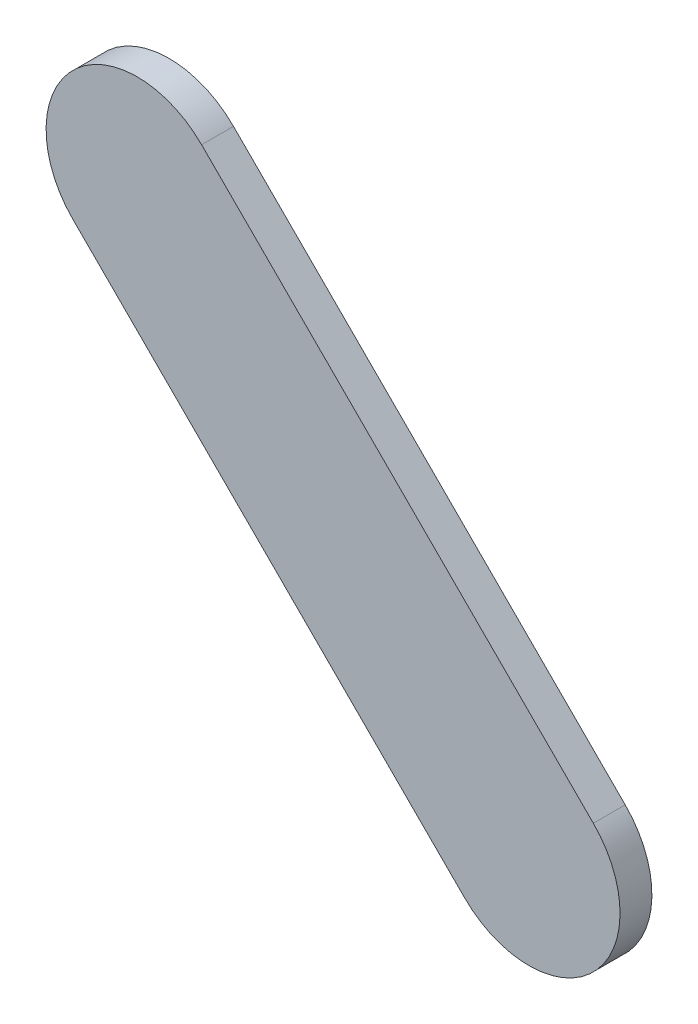
ISO-10303-21;
HEADER;
FILE_DESCRIPTION(('STEP AP214'),'2;1');
FILE_NAME('part.step','',(''),(''),'','','');
FILE_SCHEMA(('AUTOMOTIVE_DESIGN { 1 0 10303 214 1 1 1 1 }'));
ENDSEC;
DATA;
#1=APPLICATION_CONTEXT('core data for automotive mechanical design processes');
#2=APPLICATION_PROTOCOL_DEFINITION('international standard','automotive_design',2000,#1);
#3=PRODUCT_CONTEXT('',#1,'mechanical');
#4=PRODUCT('Part','Part','',(#3));
#5=PRODUCT_RELATED_PRODUCT_CATEGORY('part','',(#4));
#6=PRODUCT_DEFINITION_FORMATION('','',#4);
#7=PRODUCT_DEFINITION_CONTEXT('part definition',#1,'design');
#8=PRODUCT_DEFINITION('design','',#6,#7);
#9=PRODUCT_DEFINITION_SHAPE('','',#8);
#10=(LENGTH_UNIT() NAMED_UNIT(*) SI_UNIT(.MILLI.,.METRE.));
#11=(NAMED_UNIT(*) PLANE_ANGLE_UNIT() SI_UNIT($,.RADIAN.));
#12=(NAMED_UNIT(*) SI_UNIT($,.STERADIAN.) SOLID_ANGLE_UNIT());
#13=UNCERTAINTY_MEASURE_WITH_UNIT(LENGTH_MEASURE(1.E-05),#10,'distance_accuracy_value','');
#14=(GEOMETRIC_REPRESENTATION_CONTEXT(3) GLOBAL_UNCERTAINTY_ASSIGNED_CONTEXT((#13)) GLOBAL_UNIT_ASSIGNED_CONTEXT((#10,
#11,#12)) REPRESENTATION_CONTEXT('',''));
#15=CARTESIAN_POINT('',(0.,0.,0.));
#16=DIRECTION('',(0.,0.,1.));
#17=DIRECTION('',(1.,0.,0.));
#18=AXIS2_PLACEMENT_3D('',#15,#16,#17);
#19=CARTESIAN_POINT('',(81.799289,-136.47071,1.635));
#20=DIRECTION('',(0.,0.,1.));
#21=DIRECTION('',(1.,0.,0.));
#22=AXIS2_PLACEMENT_3D('',#19,#20,#21);
#23=PLANE('',#22);
#24=DIRECTION('',(0.707106781186548,-0.707106781186548,0.));
#25=VECTOR('',#24,1.);
#26=CARTESIAN_POINT('',(81.799289,-136.47071,1.635));
#27=LINE('',#26,#25);
#28=CARTESIAN_POINT('',(81.799289,-136.47071,1.635));
#29=VERTEX_POINT('',#28);
#30=CARTESIAN_POINT('',(82.229289,-136.90071,1.635));
#31=VERTEX_POINT('',#30);
#32=EDGE_CURVE('E69',#29,#31,#27,.T.);
#33=ORIENTED_EDGE('',*,*,#32,.T.);
#34=CARTESIAN_POINT('',(82.2999995,-136.8299995,1.635));
#35=DIRECTION('',(0.,0.,1.));
#36=DIRECTION('',(-0.707106781186048,-0.707106781187047,0.));
#37=AXIS2_PLACEMENT_3D('',#34,#35,#36);
#38=CIRCLE('',#37,0.09999974810219);
#39=CARTESIAN_POINT('',(82.37071,-136.759289,1.635));
#40=VERTEX_POINT('',#39);
#41=EDGE_CURVE('E66',#31,#40,#38,.T.);
#42=ORIENTED_EDGE('',*,*,#41,.T.);
#43=DIRECTION('',(-0.707106781186548,0.707106781186548,0.));
#44=VECTOR('',#43,1.);
#45=CARTESIAN_POINT('',(82.37071,-136.759289,1.635));
#46=LINE('',#45,#44);
#47=CARTESIAN_POINT('',(81.94071,-136.329289,1.635));
#48=VERTEX_POINT('',#47);
#49=EDGE_CURVE('E53',#40,#48,#46,.T.);
#50=ORIENTED_EDGE('',*,*,#49,.T.);
#51=CARTESIAN_POINT('',(81.8699995,-136.3999995,1.635));
#52=DIRECTION('',(0.,0.,1.));
#53=DIRECTION('',(0.707106781186548,0.707106781186548,0.));
#54=AXIS2_PLACEMENT_3D('',#51,#52,#53);
#55=CIRCLE('',#54,0.09999974810218);
#56=EDGE_CURVE('E11',#48,#29,#55,.T.);
#57=ORIENTED_EDGE('',*,*,#56,.T.);
#58=EDGE_LOOP('',(#33,#42,#50,#57));
#59=FACE_BOUND('',#58,.T.);
#60=ADVANCED_FACE('F17',(#59),#23,.T.);
#61=CARTESIAN_POINT('',(81.799289,-136.47071,1.6));
#62=DIRECTION('',(0.,0.,1.));
#63=DIRECTION('',(1.,0.,0.));
#64=AXIS2_PLACEMENT_3D('',#61,#62,#63);
#65=PLANE('',#64);
#66=CARTESIAN_POINT('',(81.8699995,-136.3999995,1.6));
#67=DIRECTION('',(0.,0.,1.));
#68=DIRECTION('',(0.707106781186548,0.707106781186548,0.));
#69=AXIS2_PLACEMENT_3D('',#66,#67,#68);
#70=CIRCLE('',#69,0.09999974810218);
#71=CARTESIAN_POINT('',(81.94071,-136.329289,1.6));
#72=VERTEX_POINT('',#71);
#73=CARTESIAN_POINT('',(81.799289,-136.47071,1.6));
#74=VERTEX_POINT('',#73);
#75=EDGE_CURVE('E26',#72,#74,#70,.T.);
#76=ORIENTED_EDGE('',*,*,#75,.F.);
#77=DIRECTION('',(-0.707106781186548,0.707106781186548,0.));
#78=VECTOR('',#77,1.);
#79=CARTESIAN_POINT('',(82.37071,-136.759289,1.6));
#80=LINE('',#79,#78);
#81=CARTESIAN_POINT('',(82.37071,-136.759289,1.6));
#82=VERTEX_POINT('',#81);
#83=EDGE_CURVE('E74',#82,#72,#80,.T.);
#84=ORIENTED_EDGE('',*,*,#83,.F.);
#85=CARTESIAN_POINT('',(82.2999995,-136.8299995,1.6));
#86=DIRECTION('',(0.,0.,1.));
#87=DIRECTION('',(-0.707106781186048,-0.707106781187047,0.));
#88=AXIS2_PLACEMENT_3D('',#85,#86,#87);
#89=CIRCLE('',#88,0.09999974810219);
#90=CARTESIAN_POINT('',(82.229289,-136.90071,1.6));
#91=VERTEX_POINT('',#90);
#92=EDGE_CURVE('E78',#91,#82,#89,.T.);
#93=ORIENTED_EDGE('',*,*,#92,.F.);
#94=DIRECTION('',(0.707106781186548,-0.707106781186548,0.));
#95=VECTOR('',#94,1.);
#96=CARTESIAN_POINT('',(81.799289,-136.47071,1.6));
#97=LINE('',#96,#95);
#98=EDGE_CURVE('E100',#74,#91,#97,.T.);
#99=ORIENTED_EDGE('',*,*,#98,.F.);
#100=EDGE_LOOP('',(#76,#84,#93,#99));
#101=FACE_BOUND('',#100,.T.);
#102=ADVANCED_FACE('F94',(#101),#65,.F.);
#103=CARTESIAN_POINT('',(81.8699995,-136.3999995,1.6));
#104=DIRECTION('',(0.,0.,-1.));
#105=DIRECTION('',(0.707106781186548,0.707106781186548,0.));
#106=AXIS2_PLACEMENT_3D('',#103,#104,#105);
#107=CYLINDRICAL_SURFACE('',#106,0.09999974810218);
#108=ORIENTED_EDGE('',*,*,#75,.T.);
#109=DIRECTION('',(0.,0.,1.));
#110=VECTOR('',#109,1.);
#111=CARTESIAN_POINT('',(81.799289,-136.47071,1.6));
#112=LINE('',#111,#110);
#113=EDGE_CURVE('E85',#74,#29,#112,.T.);
#114=ORIENTED_EDGE('',*,*,#113,.T.);
#115=ORIENTED_EDGE('',*,*,#56,.F.);
#116=DIRECTION('',(0.,0.,1.));
#117=VECTOR('',#116,1.);
#118=CARTESIAN_POINT('',(81.94071,-136.329289,1.6));
#119=LINE('',#118,#117);
#120=EDGE_CURVE('E60',#72,#48,#119,.T.);
#121=ORIENTED_EDGE('',*,*,#120,.F.);
#122=EDGE_LOOP('',(#108,#114,#115,#121));
#123=FACE_BOUND('',#122,.T.);
#124=ADVANCED_FACE('F104',(#123),#107,.T.);
#125=CARTESIAN_POINT('',(82.37071,-136.759289,1.6));
#126=DIRECTION('',(-0.707106781186548,-0.707106781186548,0.));
#127=DIRECTION('',(-0.707106781186548,0.707106781186548,0.));
#128=AXIS2_PLACEMENT_3D('',#125,#126,#127);
#129=PLANE('',#128);
#130=ORIENTED_EDGE('',*,*,#83,.T.);
#131=ORIENTED_EDGE('',*,*,#120,.T.);
#132=ORIENTED_EDGE('',*,*,#49,.F.);
#133=DIRECTION('',(0.,0.,1.));
#134=VECTOR('',#133,1.);
#135=CARTESIAN_POINT('',(82.37071,-136.759289,1.6));
#136=LINE('',#135,#134);
#137=EDGE_CURVE('E58',#82,#40,#136,.T.);
#138=ORIENTED_EDGE('',*,*,#137,.F.);
#139=EDGE_LOOP('',(#130,#131,#132,#138));
#140=FACE_BOUND('',#139,.T.);
#141=ADVANCED_FACE('F56',(#140),#129,.F.);
#142=CARTESIAN_POINT('',(82.2999995,-136.8299995,1.6));
#143=DIRECTION('',(0.,0.,-1.));
#144=DIRECTION('',(-0.707106781186048,-0.707106781187048,0.));
#145=AXIS2_PLACEMENT_3D('',#142,#143,#144);
#146=CYLINDRICAL_SURFACE('',#145,0.09999974810219);
#147=ORIENTED_EDGE('',*,*,#92,.T.);
#148=ORIENTED_EDGE('',*,*,#137,.T.);
#149=ORIENTED_EDGE('',*,*,#41,.F.);
#150=DIRECTION('',(0.,0.,1.));
#151=VECTOR('',#150,1.);
#152=CARTESIAN_POINT('',(82.229289,-136.90071,1.6));
#153=LINE('',#152,#151);
#154=EDGE_CURVE('E168',#91,#31,#153,.T.);
#155=ORIENTED_EDGE('',*,*,#154,.F.);
#156=EDGE_LOOP('',(#147,#148,#149,#155));
#157=FACE_BOUND('',#156,.T.);
#158=ADVANCED_FACE('F76',(#157),#146,.T.);
#159=CARTESIAN_POINT('',(81.799289,-136.47071,1.6));
#160=DIRECTION('',(0.707106781186548,0.707106781186548,0.));
#161=DIRECTION('',(0.,0.,-1.));
#162=AXIS2_PLACEMENT_3D('',#159,#160,#161);
#163=PLANE('',#162);
#164=ORIENTED_EDGE('',*,*,#98,.T.);
#165=ORIENTED_EDGE('',*,*,#154,.T.);
#166=ORIENTED_EDGE('',*,*,#32,.F.);
#167=ORIENTED_EDGE('',*,*,#113,.F.);
#168=EDGE_LOOP('',(#164,#165,#166,#167));
#169=FACE_BOUND('',#168,.T.);
#170=ADVANCED_FACE('F167',(#169),#163,.F.);
#171=CLOSED_SHELL('',(#60,#102,#124,#141,#158,#170));
#172=MANIFOLD_SOLID_BREP('B1',#171);
#173=ADVANCED_BREP_SHAPE_REPRESENTATION('',(#18,#172),#14);
#174=SHAPE_DEFINITION_REPRESENTATION(#9,#173);
ENDSEC;
END-ISO-10303-21;
